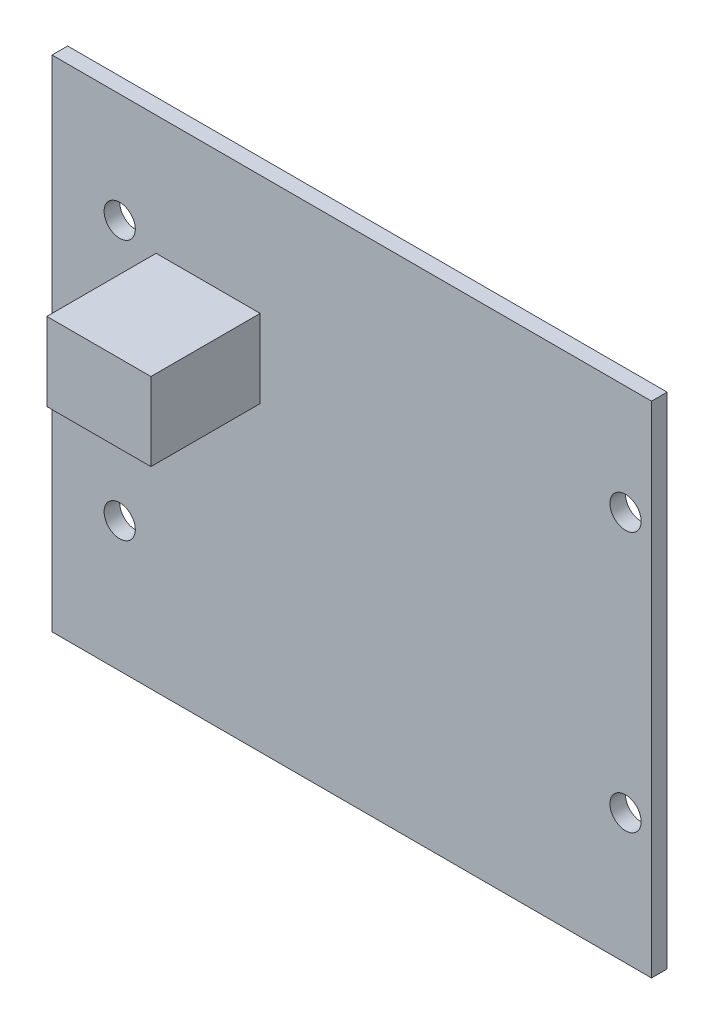
ISO-10303-21;
HEADER;
FILE_DESCRIPTION(('STEP AP214'),'2;1');
FILE_NAME('part.step','',(''),(''),'','','');
FILE_SCHEMA(('AUTOMOTIVE_DESIGN { 1 0 10303 214 1 1 1 1 }'));
ENDSEC;
DATA;
#1=APPLICATION_CONTEXT('core data for automotive mechanical design processes');
#2=APPLICATION_PROTOCOL_DEFINITION('international standard','automotive_design',2000,#1);
#3=PRODUCT_CONTEXT('',#1,'mechanical');
#4=PRODUCT('Part','Part','',(#3));
#5=PRODUCT_RELATED_PRODUCT_CATEGORY('part','',(#4));
#6=PRODUCT_DEFINITION_FORMATION('','',#4);
#7=PRODUCT_DEFINITION_CONTEXT('part definition',#1,'design');
#8=PRODUCT_DEFINITION('design','',#6,#7);
#9=PRODUCT_DEFINITION_SHAPE('','',#8);
#10=(LENGTH_UNIT() NAMED_UNIT(*) SI_UNIT(.MILLI.,.METRE.));
#11=(NAMED_UNIT(*) PLANE_ANGLE_UNIT() SI_UNIT($,.RADIAN.));
#12=(NAMED_UNIT(*) SI_UNIT($,.STERADIAN.) SOLID_ANGLE_UNIT());
#13=UNCERTAINTY_MEASURE_WITH_UNIT(LENGTH_MEASURE(1.E-05),#10,'distance_accuracy_value','');
#14=(GEOMETRIC_REPRESENTATION_CONTEXT(3) GLOBAL_UNCERTAINTY_ASSIGNED_CONTEXT((#13)) GLOBAL_UNIT_ASSIGNED_CONTEXT((#10,
#11,#12)) REPRESENTATION_CONTEXT('',''));
#15=CARTESIAN_POINT('',(0.,0.,0.));
#16=DIRECTION('',(0.,0.,1.));
#17=DIRECTION('',(1.,0.,0.));
#18=AXIS2_PLACEMENT_3D('',#15,#16,#17);
#19=CARTESIAN_POINT('',(0.,0.,1.5));
#20=DIRECTION('',(0.,0.,-1.));
#21=DIRECTION('',(-1.,0.,0.));
#22=AXIS2_PLACEMENT_3D('',#19,#20,#21);
#23=PLANE('',#22);
#24=CARTESIAN_POINT('',(55.1,12.5,1.5));
#25=DIRECTION('',(0.,0.,1.));
#26=DIRECTION('',(1.,0.,0.));
#27=AXIS2_PLACEMENT_3D('',#24,#25,#26);
#28=CIRCLE('',#27,1.5);
#29=CARTESIAN_POINT('',(56.6,12.5,1.5));
#30=VERTEX_POINT('',#29);
#31=EDGE_CURVE('E126',#30,#30,#28,.T.);
#32=ORIENTED_EDGE('',*,*,#31,.F.);
#33=EDGE_LOOP('',(#32));
#34=FACE_BOUND('',#33,.T.);
#35=CARTESIAN_POINT('',(55.1,37.5,1.5));
#36=DIRECTION('',(0.,0.,1.));
#37=DIRECTION('',(1.,0.,0.));
#38=AXIS2_PLACEMENT_3D('',#35,#36,#37);
#39=CIRCLE('',#38,1.5);
#40=CARTESIAN_POINT('',(56.6,37.5,1.5));
#41=VERTEX_POINT('',#40);
#42=EDGE_CURVE('E135',#41,#41,#39,.T.);
#43=ORIENTED_EDGE('',*,*,#42,.F.);
#44=EDGE_LOOP('',(#43));
#45=FACE_BOUND('',#44,.T.);
#46=CARTESIAN_POINT('',(6.5,12.5,1.5));
#47=DIRECTION('',(0.,0.,1.));
#48=DIRECTION('',(1.,0.,0.));
#49=AXIS2_PLACEMENT_3D('',#46,#47,#48);
#50=CIRCLE('',#49,1.5);
#51=CARTESIAN_POINT('',(8.,12.5,1.5));
#52=VERTEX_POINT('',#51);
#53=EDGE_CURVE('E141',#52,#52,#50,.T.);
#54=ORIENTED_EDGE('',*,*,#53,.F.);
#55=EDGE_LOOP('',(#54));
#56=FACE_BOUND('',#55,.T.);
#57=CARTESIAN_POINT('',(6.5,37.5,1.5));
#58=DIRECTION('',(0.,0.,1.));
#59=DIRECTION('',(1.,0.,0.));
#60=AXIS2_PLACEMENT_3D('',#57,#58,#59);
#61=CIRCLE('',#60,1.5);
#62=CARTESIAN_POINT('',(8.,37.5,1.5));
#63=VERTEX_POINT('',#62);
#64=EDGE_CURVE('E147',#63,#63,#61,.T.);
#65=ORIENTED_EDGE('',*,*,#64,.F.);
#66=EDGE_LOOP('',(#65));
#67=FACE_BOUND('',#66,.T.);
#68=DIRECTION('',(0.,-1.,0.));
#69=VECTOR('',#68,1.);
#70=CARTESIAN_POINT('',(0.,0.,1.5));
#71=LINE('',#70,#69);
#72=CARTESIAN_POINT('',(0.,48.,1.5));
#73=VERTEX_POINT('',#72);
#74=CARTESIAN_POINT('',(0.,0.,1.5));
#75=VERTEX_POINT('',#74);
#76=EDGE_CURVE('E153',#73,#75,#71,.T.);
#77=ORIENTED_EDGE('',*,*,#76,.T.);
#78=DIRECTION('',(1.,0.,0.));
#79=VECTOR('',#78,1.);
#80=CARTESIAN_POINT('',(0.,0.,1.5));
#81=LINE('',#80,#79);
#82=CARTESIAN_POINT('',(57.6,0.,1.5));
#83=VERTEX_POINT('',#82);
#84=EDGE_CURVE('E156',#75,#83,#81,.T.);
#85=ORIENTED_EDGE('',*,*,#84,.T.);
#86=DIRECTION('',(0.,1.,0.));
#87=VECTOR('',#86,1.);
#88=CARTESIAN_POINT('',(57.6,0.,1.5));
#89=LINE('',#88,#87);
#90=CARTESIAN_POINT('',(57.6,48.,1.5));
#91=VERTEX_POINT('',#90);
#92=EDGE_CURVE('E159',#83,#91,#89,.T.);
#93=ORIENTED_EDGE('',*,*,#92,.T.);
#94=DIRECTION('',(-1.,0.,0.));
#95=VECTOR('',#94,1.);
#96=CARTESIAN_POINT('',(0.,48.,1.5));
#97=LINE('',#96,#95);
#98=EDGE_CURVE('E161',#91,#73,#97,.T.);
#99=ORIENTED_EDGE('',*,*,#98,.T.);
#100=EDGE_LOOP('',(#77,#85,#93,#99));
#101=FACE_BOUND('',#100,.T.);
#102=DIRECTION('',(0.,-1.,0.));
#103=VECTOR('',#102,1.);
#104=CARTESIAN_POINT('',(10.,36.5,1.5));
#105=LINE('',#104,#103);
#106=CARTESIAN_POINT('',(10.,36.5,1.5));
#107=VERTEX_POINT('',#106);
#108=CARTESIAN_POINT('',(10.,29.,1.5));
#109=VERTEX_POINT('',#108);
#110=EDGE_CURVE('E122',#107,#109,#105,.T.);
#111=ORIENTED_EDGE('',*,*,#110,.F.);
#112=DIRECTION('',(-1.,0.,0.));
#113=VECTOR('',#112,1.);
#114=CARTESIAN_POINT('',(10.,36.5,1.5));
#115=LINE('',#114,#113);
#116=CARTESIAN_POINT('',(20.,36.5,1.5));
#117=VERTEX_POINT('',#116);
#118=EDGE_CURVE('E119',#117,#107,#115,.T.);
#119=ORIENTED_EDGE('',*,*,#118,.F.);
#120=DIRECTION('',(0.,1.,0.));
#121=VECTOR('',#120,1.);
#122=CARTESIAN_POINT('',(20.,36.5,1.5));
#123=LINE('',#122,#121);
#124=CARTESIAN_POINT('',(20.,29.,1.5));
#125=VERTEX_POINT('',#124);
#126=EDGE_CURVE('E57',#125,#117,#123,.T.);
#127=ORIENTED_EDGE('',*,*,#126,.F.);
#128=DIRECTION('',(1.,0.,0.));
#129=VECTOR('',#128,1.);
#130=CARTESIAN_POINT('',(10.,29.,1.5));
#131=LINE('',#130,#129);
#132=EDGE_CURVE('E52',#109,#125,#131,.T.);
#133=ORIENTED_EDGE('',*,*,#132,.F.);
#134=EDGE_LOOP('',(#111,#119,#127,#133));
#135=FACE_BOUND('',#134,.T.);
#136=ADVANCED_FACE('F37',(#34,#45,#56,#67,#101,#135),#23,.F.);
#137=CARTESIAN_POINT('',(0.,0.,0.));
#138=DIRECTION('',(0.,0.,-1.));
#139=DIRECTION('',(-1.,0.,0.));
#140=AXIS2_PLACEMENT_3D('',#137,#138,#139);
#141=PLANE('',#140);
#142=CARTESIAN_POINT('',(55.1,37.5,0.));
#143=DIRECTION('',(0.,0.,1.));
#144=DIRECTION('',(1.,0.,0.));
#145=AXIS2_PLACEMENT_3D('',#142,#143,#144);
#146=CIRCLE('',#145,1.5);
#147=CARTESIAN_POINT('',(56.6,37.5,0.));
#148=VERTEX_POINT('',#147);
#149=EDGE_CURVE('E133',#148,#148,#146,.T.);
#150=ORIENTED_EDGE('',*,*,#149,.T.);
#151=EDGE_LOOP('',(#150));
#152=FACE_BOUND('',#151,.T.);
#153=CARTESIAN_POINT('',(6.5,37.5,0.));
#154=DIRECTION('',(0.,0.,1.));
#155=DIRECTION('',(1.,0.,0.));
#156=AXIS2_PLACEMENT_3D('',#153,#154,#155);
#157=CIRCLE('',#156,1.5);
#158=CARTESIAN_POINT('',(8.,37.5,0.));
#159=VERTEX_POINT('',#158);
#160=EDGE_CURVE('E144',#159,#159,#157,.T.);
#161=ORIENTED_EDGE('',*,*,#160,.T.);
#162=EDGE_LOOP('',(#161));
#163=FACE_BOUND('',#162,.T.);
#164=DIRECTION('',(0.,-1.,0.));
#165=VECTOR('',#164,1.);
#166=CARTESIAN_POINT('',(0.,0.,0.));
#167=LINE('',#166,#165);
#168=CARTESIAN_POINT('',(0.,48.,0.));
#169=VERTEX_POINT('',#168);
#170=CARTESIAN_POINT('',(0.,0.,0.));
#171=VERTEX_POINT('',#170);
#172=EDGE_CURVE('E150',#169,#171,#167,.T.);
#173=ORIENTED_EDGE('',*,*,#172,.F.);
#174=DIRECTION('',(-1.,0.,0.));
#175=VECTOR('',#174,1.);
#176=CARTESIAN_POINT('',(0.,48.,0.));
#177=LINE('',#176,#175);
#178=CARTESIAN_POINT('',(57.6,48.,0.));
#179=VERTEX_POINT('',#178);
#180=EDGE_CURVE('E157',#179,#169,#177,.T.);
#181=ORIENTED_EDGE('',*,*,#180,.F.);
#182=DIRECTION('',(0.,1.,0.));
#183=VECTOR('',#182,1.);
#184=CARTESIAN_POINT('',(57.6,0.,0.));
#185=LINE('',#184,#183);
#186=CARTESIAN_POINT('',(57.6,0.,0.));
#187=VERTEX_POINT('',#186);
#188=EDGE_CURVE('E168',#187,#179,#185,.T.);
#189=ORIENTED_EDGE('',*,*,#188,.F.);
#190=DIRECTION('',(1.,0.,0.));
#191=VECTOR('',#190,1.);
#192=CARTESIAN_POINT('',(0.,0.,0.));
#193=LINE('',#192,#191);
#194=EDGE_CURVE('E166',#171,#187,#193,.T.);
#195=ORIENTED_EDGE('',*,*,#194,.F.);
#196=EDGE_LOOP('',(#173,#181,#189,#195));
#197=FACE_BOUND('',#196,.T.);
#198=CARTESIAN_POINT('',(6.5,12.5,0.));
#199=DIRECTION('',(0.,0.,1.));
#200=DIRECTION('',(1.,0.,0.));
#201=AXIS2_PLACEMENT_3D('',#198,#199,#200);
#202=CIRCLE('',#201,1.5);
#203=CARTESIAN_POINT('',(8.,12.5,0.));
#204=VERTEX_POINT('',#203);
#205=EDGE_CURVE('E138',#204,#204,#202,.T.);
#206=ORIENTED_EDGE('',*,*,#205,.T.);
#207=EDGE_LOOP('',(#206));
#208=FACE_BOUND('',#207,.T.);
#209=CARTESIAN_POINT('',(55.1,12.5,0.));
#210=DIRECTION('',(0.,0.,1.));
#211=DIRECTION('',(1.,0.,0.));
#212=AXIS2_PLACEMENT_3D('',#209,#210,#211);
#213=CIRCLE('',#212,1.5);
#214=CARTESIAN_POINT('',(56.6,12.5,0.));
#215=VERTEX_POINT('',#214);
#216=EDGE_CURVE('E123',#215,#215,#213,.T.);
#217=ORIENTED_EDGE('',*,*,#216,.T.);
#218=EDGE_LOOP('',(#217));
#219=FACE_BOUND('',#218,.T.);
#220=ADVANCED_FACE('F186',(#152,#163,#197,#208,#219),#141,.T.);
#221=CARTESIAN_POINT('',(0.,0.,1.5));
#222=DIRECTION('',(1.,0.,0.));
#223=DIRECTION('',(0.,0.,-1.));
#224=AXIS2_PLACEMENT_3D('',#221,#222,#223);
#225=PLANE('',#224);
#226=ORIENTED_EDGE('',*,*,#172,.T.);
#227=DIRECTION('',(0.,0.,-1.));
#228=VECTOR('',#227,1.);
#229=CARTESIAN_POINT('',(0.,0.,1.5));
#230=LINE('',#229,#228);
#231=EDGE_CURVE('E11',#75,#171,#230,.T.);
#232=ORIENTED_EDGE('',*,*,#231,.F.);
#233=ORIENTED_EDGE('',*,*,#76,.F.);
#234=DIRECTION('',(0.,0.,-1.));
#235=VECTOR('',#234,1.);
#236=CARTESIAN_POINT('',(0.,48.,1.5));
#237=LINE('',#236,#235);
#238=EDGE_CURVE('E163',#73,#169,#237,.T.);
#239=ORIENTED_EDGE('',*,*,#238,.T.);
#240=EDGE_LOOP('',(#226,#232,#233,#239));
#241=FACE_BOUND('',#240,.T.);
#242=ADVANCED_FACE('F39',(#241),#225,.F.);
#243=CARTESIAN_POINT('',(0.,0.,1.5));
#244=DIRECTION('',(0.,1.,0.));
#245=DIRECTION('',(0.,0.,1.));
#246=AXIS2_PLACEMENT_3D('',#243,#244,#245);
#247=PLANE('',#246);
#248=ORIENTED_EDGE('',*,*,#194,.T.);
#249=DIRECTION('',(0.,0.,-1.));
#250=VECTOR('',#249,1.);
#251=CARTESIAN_POINT('',(57.6,0.,1.5));
#252=LINE('',#251,#250);
#253=EDGE_CURVE('E45',#83,#187,#252,.T.);
#254=ORIENTED_EDGE('',*,*,#253,.F.);
#255=ORIENTED_EDGE('',*,*,#84,.F.);
#256=ORIENTED_EDGE('',*,*,#231,.T.);
#257=EDGE_LOOP('',(#248,#254,#255,#256));
#258=FACE_BOUND('',#257,.T.);
#259=ADVANCED_FACE('F196',(#258),#247,.F.);
#260=CARTESIAN_POINT('',(57.6,0.,1.5));
#261=DIRECTION('',(-1.,0.,0.));
#262=DIRECTION('',(0.,0.,1.));
#263=AXIS2_PLACEMENT_3D('',#260,#261,#262);
#264=PLANE('',#263);
#265=ORIENTED_EDGE('',*,*,#188,.T.);
#266=DIRECTION('',(0.,0.,-1.));
#267=VECTOR('',#266,1.);
#268=CARTESIAN_POINT('',(57.6,48.,1.5));
#269=LINE('',#268,#267);
#270=EDGE_CURVE('E173',#91,#179,#269,.T.);
#271=ORIENTED_EDGE('',*,*,#270,.F.);
#272=ORIENTED_EDGE('',*,*,#92,.F.);
#273=ORIENTED_EDGE('',*,*,#253,.T.);
#274=EDGE_LOOP('',(#265,#271,#272,#273));
#275=FACE_BOUND('',#274,.T.);
#276=ADVANCED_FACE('F180',(#275),#264,.F.);
#277=CARTESIAN_POINT('',(0.,48.,1.5));
#278=DIRECTION('',(0.,-1.,0.));
#279=DIRECTION('',(0.,0.,-1.));
#280=AXIS2_PLACEMENT_3D('',#277,#278,#279);
#281=PLANE('',#280);
#282=ORIENTED_EDGE('',*,*,#180,.T.);
#283=ORIENTED_EDGE('',*,*,#238,.F.);
#284=ORIENTED_EDGE('',*,*,#98,.F.);
#285=ORIENTED_EDGE('',*,*,#270,.T.);
#286=EDGE_LOOP('',(#282,#283,#284,#285));
#287=FACE_BOUND('',#286,.T.);
#288=ADVANCED_FACE('F190',(#287),#281,.F.);
#289=CARTESIAN_POINT('',(6.5,37.5,1.5));
#290=DIRECTION('',(0.,0.,-1.));
#291=DIRECTION('',(-1.,0.,0.));
#292=AXIS2_PLACEMENT_3D('',#289,#290,#291);
#293=CYLINDRICAL_SURFACE('',#292,1.5);
#294=ORIENTED_EDGE('',*,*,#64,.T.);
#295=EDGE_LOOP('',(#294));
#296=FACE_BOUND('',#295,.T.);
#297=ORIENTED_EDGE('',*,*,#160,.F.);
#298=EDGE_LOOP('',(#297));
#299=FACE_BOUND('',#298,.T.);
#300=ADVANCED_FACE('F214',(#296,#299),#293,.F.);
#301=CARTESIAN_POINT('',(6.5,12.5,1.5));
#302=DIRECTION('',(0.,0.,-1.));
#303=DIRECTION('',(-1.,0.,0.));
#304=AXIS2_PLACEMENT_3D('',#301,#302,#303);
#305=CYLINDRICAL_SURFACE('',#304,1.5);
#306=ORIENTED_EDGE('',*,*,#53,.T.);
#307=EDGE_LOOP('',(#306));
#308=FACE_BOUND('',#307,.T.);
#309=ORIENTED_EDGE('',*,*,#205,.F.);
#310=EDGE_LOOP('',(#309));
#311=FACE_BOUND('',#310,.T.);
#312=ADVANCED_FACE('F221',(#308,#311),#305,.F.);
#313=CARTESIAN_POINT('',(55.1,37.5,1.5));
#314=DIRECTION('',(0.,0.,-1.));
#315=DIRECTION('',(-1.,0.,0.));
#316=AXIS2_PLACEMENT_3D('',#313,#314,#315);
#317=CYLINDRICAL_SURFACE('',#316,1.5);
#318=ORIENTED_EDGE('',*,*,#42,.T.);
#319=EDGE_LOOP('',(#318));
#320=FACE_BOUND('',#319,.T.);
#321=ORIENTED_EDGE('',*,*,#149,.F.);
#322=EDGE_LOOP('',(#321));
#323=FACE_BOUND('',#322,.T.);
#324=ADVANCED_FACE('F226',(#320,#323),#317,.F.);
#325=CARTESIAN_POINT('',(55.1,12.5,1.5));
#326=DIRECTION('',(0.,0.,-1.));
#327=DIRECTION('',(-1.,0.,0.));
#328=AXIS2_PLACEMENT_3D('',#325,#326,#327);
#329=CYLINDRICAL_SURFACE('',#328,1.5);
#330=ORIENTED_EDGE('',*,*,#31,.T.);
#331=EDGE_LOOP('',(#330));
#332=FACE_BOUND('',#331,.T.);
#333=ORIENTED_EDGE('',*,*,#216,.F.);
#334=EDGE_LOOP('',(#333));
#335=FACE_BOUND('',#334,.T.);
#336=ADVANCED_FACE('F236',(#332,#335),#329,.F.);
#337=CARTESIAN_POINT('',(10.,36.5,12.));
#338=DIRECTION('',(1.,0.,0.));
#339=DIRECTION('',(0.,1.,0.));
#340=AXIS2_PLACEMENT_3D('',#337,#338,#339);
#341=PLANE('',#340);
#342=ORIENTED_EDGE('',*,*,#110,.T.);
#343=DIRECTION('',(0.,0.,-1.));
#344=VECTOR('',#343,1.);
#345=CARTESIAN_POINT('',(10.,29.,12.));
#346=LINE('',#345,#344);
#347=CARTESIAN_POINT('',(10.,29.,12.));
#348=VERTEX_POINT('',#347);
#349=EDGE_CURVE('E103',#348,#109,#346,.T.);
#350=ORIENTED_EDGE('',*,*,#349,.F.);
#351=DIRECTION('',(0.,-1.,0.));
#352=VECTOR('',#351,1.);
#353=CARTESIAN_POINT('',(10.,36.5,12.));
#354=LINE('',#353,#352);
#355=CARTESIAN_POINT('',(10.,36.5,12.));
#356=VERTEX_POINT('',#355);
#357=EDGE_CURVE('E110',#356,#348,#354,.T.);
#358=ORIENTED_EDGE('',*,*,#357,.F.);
#359=DIRECTION('',(0.,0.,-1.));
#360=VECTOR('',#359,1.);
#361=CARTESIAN_POINT('',(10.,36.5,12.));
#362=LINE('',#361,#360);
#363=EDGE_CURVE('E339',#356,#107,#362,.T.);
#364=ORIENTED_EDGE('',*,*,#363,.T.);
#365=EDGE_LOOP('',(#342,#350,#358,#364));
#366=FACE_BOUND('',#365,.T.);
#367=ADVANCED_FACE('F121',(#366),#341,.F.);
#368=CARTESIAN_POINT('',(10.,29.,12.));
#369=DIRECTION('',(0.,1.,0.));
#370=DIRECTION('',(0.,0.,1.));
#371=AXIS2_PLACEMENT_3D('',#368,#369,#370);
#372=PLANE('',#371);
#373=ORIENTED_EDGE('',*,*,#132,.T.);
#374=DIRECTION('',(0.,0.,-1.));
#375=VECTOR('',#374,1.);
#376=CARTESIAN_POINT('',(20.,29.,12.));
#377=LINE('',#376,#375);
#378=CARTESIAN_POINT('',(20.,29.,12.));
#379=VERTEX_POINT('',#378);
#380=EDGE_CURVE('E106',#379,#125,#377,.T.);
#381=ORIENTED_EDGE('',*,*,#380,.F.);
#382=DIRECTION('',(1.,0.,0.));
#383=VECTOR('',#382,1.);
#384=CARTESIAN_POINT('',(10.,29.,12.));
#385=LINE('',#384,#383);
#386=EDGE_CURVE('E99',#348,#379,#385,.T.);
#387=ORIENTED_EDGE('',*,*,#386,.F.);
#388=ORIENTED_EDGE('',*,*,#349,.T.);
#389=EDGE_LOOP('',(#373,#381,#387,#388));
#390=FACE_BOUND('',#389,.T.);
#391=ADVANCED_FACE('F101',(#390),#372,.F.);
#392=CARTESIAN_POINT('',(20.,36.5,12.));
#393=DIRECTION('',(-1.,0.,0.));
#394=DIRECTION('',(0.,-1.,0.));
#395=AXIS2_PLACEMENT_3D('',#392,#393,#394);
#396=PLANE('',#395);
#397=ORIENTED_EDGE('',*,*,#126,.T.);
#398=DIRECTION('',(0.,0.,-1.));
#399=VECTOR('',#398,1.);
#400=CARTESIAN_POINT('',(20.,36.5,12.));
#401=LINE('',#400,#399);
#402=CARTESIAN_POINT('',(20.,36.5,12.));
#403=VERTEX_POINT('',#402);
#404=EDGE_CURVE('E128',#403,#117,#401,.T.);
#405=ORIENTED_EDGE('',*,*,#404,.F.);
#406=DIRECTION('',(0.,1.,0.));
#407=VECTOR('',#406,1.);
#408=CARTESIAN_POINT('',(20.,36.5,12.));
#409=LINE('',#408,#407);
#410=EDGE_CURVE('E109',#379,#403,#409,.T.);
#411=ORIENTED_EDGE('',*,*,#410,.F.);
#412=ORIENTED_EDGE('',*,*,#380,.T.);
#413=EDGE_LOOP('',(#397,#405,#411,#412));
#414=FACE_BOUND('',#413,.T.);
#415=ADVANCED_FACE('F248',(#414),#396,.F.);
#416=CARTESIAN_POINT('',(10.,36.5,12.));
#417=DIRECTION('',(0.,-1.,0.));
#418=DIRECTION('',(0.,0.,-1.));
#419=AXIS2_PLACEMENT_3D('',#416,#417,#418);
#420=PLANE('',#419);
#421=ORIENTED_EDGE('',*,*,#118,.T.);
#422=ORIENTED_EDGE('',*,*,#363,.F.);
#423=DIRECTION('',(-1.,0.,0.));
#424=VECTOR('',#423,1.);
#425=CARTESIAN_POINT('',(10.,36.5,12.));
#426=LINE('',#425,#424);
#427=EDGE_CURVE('E115',#403,#356,#426,.T.);
#428=ORIENTED_EDGE('',*,*,#427,.F.);
#429=ORIENTED_EDGE('',*,*,#404,.T.);
#430=EDGE_LOOP('',(#421,#422,#428,#429));
#431=FACE_BOUND('',#430,.T.);
#432=ADVANCED_FACE('F251',(#431),#420,.F.);
#433=CARTESIAN_POINT('',(0.,0.,12.));
#434=DIRECTION('',(0.,0.,1.));
#435=DIRECTION('',(1.,0.,0.));
#436=AXIS2_PLACEMENT_3D('',#433,#434,#435);
#437=PLANE('',#436);
#438=ORIENTED_EDGE('',*,*,#357,.T.);
#439=ORIENTED_EDGE('',*,*,#386,.T.);
#440=ORIENTED_EDGE('',*,*,#410,.T.);
#441=ORIENTED_EDGE('',*,*,#427,.T.);
#442=EDGE_LOOP('',(#438,#439,#440,#441));
#443=FACE_BOUND('',#442,.T.);
#444=ADVANCED_FACE('F113',(#443),#437,.T.);
#445=CLOSED_SHELL('',(#136,#220,#242,#259,#276,#288,#300,#312,#324,#336,#367,#391,#415,#432,#444));
#446=MANIFOLD_SOLID_BREP('B2',#445);
#447=ADVANCED_BREP_SHAPE_REPRESENTATION('',(#18,#446),#14);
#448=SHAPE_DEFINITION_REPRESENTATION(#9,#447);
ENDSEC;
END-ISO-10303-21;
